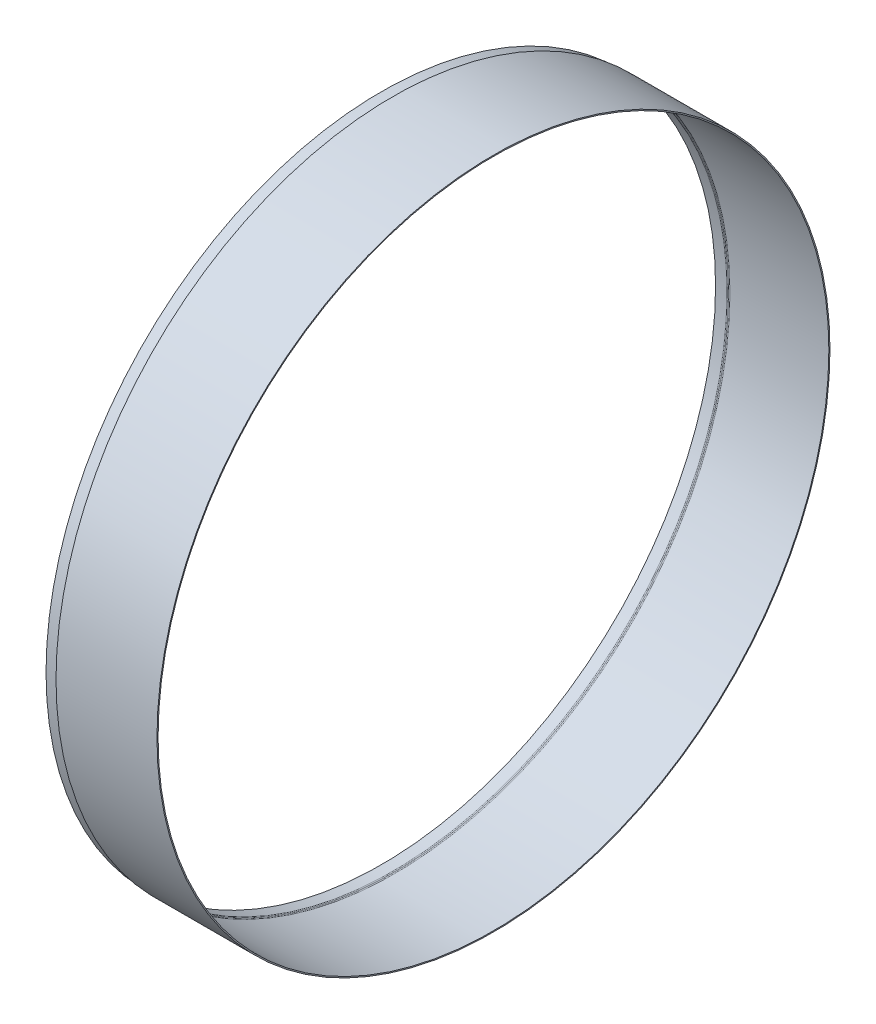
ISO-10303-21;
HEADER;
FILE_DESCRIPTION(('STEP AP214'),'2;1');
FILE_NAME('part.step','',(''),(''),'','','');
FILE_SCHEMA(('AUTOMOTIVE_DESIGN { 1 0 10303 214 1 1 1 1 }'));
ENDSEC;
DATA;
#1=APPLICATION_CONTEXT('core data for automotive mechanical design processes');
#2=APPLICATION_PROTOCOL_DEFINITION('international standard','automotive_design',2000,#1);
#3=PRODUCT_CONTEXT('',#1,'mechanical');
#4=PRODUCT('Part','Part','',(#3));
#5=PRODUCT_RELATED_PRODUCT_CATEGORY('part','',(#4));
#6=PRODUCT_DEFINITION_FORMATION('','',#4);
#7=PRODUCT_DEFINITION_CONTEXT('part definition',#1,'design');
#8=PRODUCT_DEFINITION('design','',#6,#7);
#9=PRODUCT_DEFINITION_SHAPE('','',#8);
#10=(LENGTH_UNIT() NAMED_UNIT(*) SI_UNIT(.MILLI.,.METRE.));
#11=(NAMED_UNIT(*) PLANE_ANGLE_UNIT() SI_UNIT($,.RADIAN.));
#12=(NAMED_UNIT(*) SI_UNIT($,.STERADIAN.) SOLID_ANGLE_UNIT());
#13=UNCERTAINTY_MEASURE_WITH_UNIT(LENGTH_MEASURE(1.E-05),#10,'distance_accuracy_value','');
#14=(GEOMETRIC_REPRESENTATION_CONTEXT(3) GLOBAL_UNCERTAINTY_ASSIGNED_CONTEXT((#13)) GLOBAL_UNIT_ASSIGNED_CONTEXT((#10,
#11,#12)) REPRESENTATION_CONTEXT('',''));
#15=CARTESIAN_POINT('',(0.,0.,0.));
#16=DIRECTION('',(0.,0.,1.));
#17=DIRECTION('',(1.,0.,0.));
#18=AXIS2_PLACEMENT_3D('',#15,#16,#17);
#19=CARTESIAN_POINT('',(-500.,0.,0.));
#20=DIRECTION('',(1.,0.,0.));
#21=DIRECTION('',(0.,0.,-1.));
#22=AXIS2_PLACEMENT_3D('',#19,#20,#21);
#23=CYLINDRICAL_SURFACE('',#22,1494.5);
#24=CARTESIAN_POINT('',(-450.,0.,0.));
#25=DIRECTION('',(1.,0.,0.));
#26=DIRECTION('',(0.,0.,-1.));
#27=AXIS2_PLACEMENT_3D('',#24,#25,#26);
#28=CIRCLE('',#27,1494.5);
#29=CARTESIAN_POINT('',(-450.,0.,-1494.5));
#30=VERTEX_POINT('',#29);
#31=EDGE_CURVE('E12',#30,#30,#28,.T.);
#32=ORIENTED_EDGE('',*,*,#31,.F.);
#33=EDGE_LOOP('',(#32));
#34=FACE_BOUND('',#33,.T.);
#35=CARTESIAN_POINT('',(-500.,0.,0.));
#36=DIRECTION('',(1.,0.,0.));
#37=DIRECTION('',(0.,0.,-1.));
#38=AXIS2_PLACEMENT_3D('',#35,#36,#37);
#39=CIRCLE('',#38,1494.5);
#40=CARTESIAN_POINT('',(-500.,0.,-1494.5));
#41=VERTEX_POINT('',#40);
#42=EDGE_CURVE('E76',#41,#41,#39,.T.);
#43=ORIENTED_EDGE('',*,*,#42,.T.);
#44=EDGE_LOOP('',(#43));
#45=FACE_BOUND('',#44,.T.);
#46=ADVANCED_FACE('F18',(#34,#45),#23,.T.);
#47=CARTESIAN_POINT('',(-450.,0.,0.));
#48=DIRECTION('',(-1.,0.,0.));
#49=DIRECTION('',(0.,0.,1.));
#50=AXIS2_PLACEMENT_3D('',#47,#48,#49);
#51=PLANE('',#50);
#52=ORIENTED_EDGE('',*,*,#31,.T.);
#53=EDGE_LOOP('',(#52));
#54=FACE_BOUND('',#53,.T.);
#55=CARTESIAN_POINT('',(-450.,0.,0.));
#56=DIRECTION('',(1.,0.,0.));
#57=DIRECTION('',(0.,0.,-1.));
#58=AXIS2_PLACEMENT_3D('',#55,#56,#57);
#59=CIRCLE('',#58,1500.);
#60=CARTESIAN_POINT('',(-450.,0.,-1500.));
#61=VERTEX_POINT('',#60);
#62=EDGE_CURVE('E29',#61,#61,#59,.T.);
#63=ORIENTED_EDGE('',*,*,#62,.F.);
#64=EDGE_LOOP('',(#63));
#65=FACE_BOUND('',#64,.T.);
#66=ADVANCED_FACE('F100',(#54,#65),#51,.T.);
#67=CARTESIAN_POINT('',(-450.,0.,0.));
#68=DIRECTION('',(1.,0.,0.));
#69=DIRECTION('',(0.,0.,-1.));
#70=AXIS2_PLACEMENT_3D('',#67,#68,#69);
#71=CYLINDRICAL_SURFACE('',#70,1500.);
#72=CARTESIAN_POINT('',(1.83084696472529E-13,0.,0.));
#73=DIRECTION('',(1.,0.,0.));
#74=DIRECTION('',(0.,0.,-1.));
#75=AXIS2_PLACEMENT_3D('',#72,#73,#74);
#76=CIRCLE('',#75,1500.);
#77=CARTESIAN_POINT('',(1.83697019872103E-13,0.,-1500.));
#78=VERTEX_POINT('',#77);
#79=EDGE_CURVE('E85',#78,#78,#76,.T.);
#80=ORIENTED_EDGE('',*,*,#79,.F.);
#81=EDGE_LOOP('',(#80));
#82=FACE_BOUND('',#81,.T.);
#83=ORIENTED_EDGE('',*,*,#62,.T.);
#84=EDGE_LOOP('',(#83));
#85=FACE_BOUND('',#84,.T.);
#86=ADVANCED_FACE('F98',(#82,#85),#71,.T.);
#87=CARTESIAN_POINT('',(1.83084696472529E-13,0.,0.));
#88=DIRECTION('',(1.,0.,0.));
#89=DIRECTION('',(0.,1.,0.));
#90=AXIS2_PLACEMENT_3D('',#87,#88,#89);
#91=PLANE('',#90);
#92=CARTESIAN_POINT('',(1.83084696472529E-13,0.,0.));
#93=DIRECTION('',(1.,0.,0.));
#94=DIRECTION('',(0.,0.,-1.));
#95=AXIS2_PLACEMENT_3D('',#92,#93,#94);
#96=CIRCLE('',#95,1495.);
#97=CARTESIAN_POINT('',(1.83084696472529E-13,0.,-1495.));
#98=VERTEX_POINT('',#97);
#99=EDGE_CURVE('E71',#98,#98,#96,.T.);
#100=ORIENTED_EDGE('',*,*,#99,.F.);
#101=EDGE_LOOP('',(#100));
#102=FACE_BOUND('',#101,.T.);
#103=ORIENTED_EDGE('',*,*,#79,.T.);
#104=EDGE_LOOP('',(#103));
#105=FACE_BOUND('',#104,.T.);
#106=ADVANCED_FACE('F108',(#102,#105),#91,.T.);
#107=CARTESIAN_POINT('',(1.83084696472529E-13,0.,0.));
#108=DIRECTION('',(1.,0.,0.));
#109=DIRECTION('',(0.,0.,-1.));
#110=AXIS2_PLACEMENT_3D('',#107,#108,#109);
#111=CYLINDRICAL_SURFACE('',#110,1495.);
#112=ORIENTED_EDGE('',*,*,#99,.T.);
#113=EDGE_LOOP('',(#112));
#114=FACE_BOUND('',#113,.T.);
#115=CARTESIAN_POINT('',(-440.669872981078,0.,0.));
#116=DIRECTION('',(1.,0.,0.));
#117=DIRECTION('',(0.,0.,-1.));
#118=AXIS2_PLACEMENT_3D('',#115,#116,#117);
#119=CIRCLE('',#118,1495.);
#120=CARTESIAN_POINT('',(-440.669872981078,0.,-1495.));
#121=VERTEX_POINT('',#120);
#122=EDGE_CURVE('E22',#121,#121,#119,.T.);
#123=ORIENTED_EDGE('',*,*,#122,.F.);
#124=EDGE_LOOP('',(#123));
#125=FACE_BOUND('',#124,.T.);
#126=ADVANCED_FACE('F115',(#114,#125),#111,.F.);
#127=CARTESIAN_POINT('',(-440.669872981078,0.,0.));
#128=DIRECTION('',(1.,0.,0.));
#129=DIRECTION('',(0.,0.,-1.));
#130=AXIS2_PLACEMENT_3D('',#127,#128,#129);
#131=TOROIDAL_SURFACE('',#130,1490.,5.);
#132=ORIENTED_EDGE('',*,*,#122,.T.);
#133=EDGE_LOOP('',(#132));
#134=FACE_BOUND('',#133,.T.);
#135=CARTESIAN_POINT('',(-445.,0.,0.));
#136=DIRECTION('',(1.,0.,0.));
#137=DIRECTION('',(0.,0.,-1.));
#138=AXIS2_PLACEMENT_3D('',#135,#136,#137);
#139=CIRCLE('',#138,1492.5);
#140=CARTESIAN_POINT('',(-445.,0.,-1492.5));
#141=VERTEX_POINT('',#140);
#142=EDGE_CURVE('E59',#141,#141,#139,.T.);
#143=ORIENTED_EDGE('',*,*,#142,.F.);
#144=EDGE_LOOP('',(#143));
#145=FACE_BOUND('',#144,.T.);
#146=ADVANCED_FACE('F123',(#134,#145),#131,.F.);
#147=CARTESIAN_POINT('',(-449.330127018922,0.,0.));
#148=DIRECTION('',(1.,0.,0.));
#149=DIRECTION('',(0.,0.,-1.));
#150=AXIS2_PLACEMENT_3D('',#147,#148,#149);
#151=TOROIDAL_SURFACE('',#150,1495.,5.);
#152=ORIENTED_EDGE('',*,*,#142,.T.);
#153=EDGE_LOOP('',(#152));
#154=FACE_BOUND('',#153,.T.);
#155=CARTESIAN_POINT('',(-449.330127018922,0.,0.));
#156=DIRECTION('',(1.,0.,0.));
#157=DIRECTION('',(0.,0.,-1.));
#158=AXIS2_PLACEMENT_3D('',#155,#156,#157);
#159=CIRCLE('',#158,1490.);
#160=CARTESIAN_POINT('',(-449.330127018922,0.,-1490.));
#161=VERTEX_POINT('',#160);
#162=EDGE_CURVE('E64',#161,#161,#159,.T.);
#163=ORIENTED_EDGE('',*,*,#162,.F.);
#164=EDGE_LOOP('',(#163));
#165=FACE_BOUND('',#164,.T.);
#166=ADVANCED_FACE('F60',(#154,#165),#151,.T.);
#167=CARTESIAN_POINT('',(-449.330127018922,0.,0.));
#168=DIRECTION('',(1.,0.,0.));
#169=DIRECTION('',(0.,0.,-1.));
#170=AXIS2_PLACEMENT_3D('',#167,#168,#169);
#171=CYLINDRICAL_SURFACE('',#170,1490.);
#172=ORIENTED_EDGE('',*,*,#162,.T.);
#173=EDGE_LOOP('',(#172));
#174=FACE_BOUND('',#173,.T.);
#175=CARTESIAN_POINT('',(-500.,0.,0.));
#176=DIRECTION('',(1.,0.,0.));
#177=DIRECTION('',(0.,0.,-1.));
#178=AXIS2_PLACEMENT_3D('',#175,#176,#177);
#179=CIRCLE('',#178,1490.);
#180=CARTESIAN_POINT('',(-500.,0.,-1490.));
#181=VERTEX_POINT('',#180);
#182=EDGE_CURVE('E72',#181,#181,#179,.T.);
#183=ORIENTED_EDGE('',*,*,#182,.F.);
#184=EDGE_LOOP('',(#183));
#185=FACE_BOUND('',#184,.T.);
#186=ADVANCED_FACE('F116',(#174,#185),#171,.F.);
#187=CARTESIAN_POINT('',(-500.,0.,0.));
#188=DIRECTION('',(-1.,0.,0.));
#189=DIRECTION('',(0.,0.,1.));
#190=AXIS2_PLACEMENT_3D('',#187,#188,#189);
#191=PLANE('',#190);
#192=ORIENTED_EDGE('',*,*,#182,.T.);
#193=EDGE_LOOP('',(#192));
#194=FACE_BOUND('',#193,.T.);
#195=ORIENTED_EDGE('',*,*,#42,.F.);
#196=EDGE_LOOP('',(#195));
#197=FACE_BOUND('',#196,.T.);
#198=ADVANCED_FACE('F20',(#194,#197),#191,.T.);
#199=CLOSED_SHELL('',(#46,#66,#86,#106,#126,#146,#166,#186,#198));
#200=MANIFOLD_SOLID_BREP('B1',#199);
#201=ADVANCED_BREP_SHAPE_REPRESENTATION('',(#18,#200),#14);
#202=SHAPE_DEFINITION_REPRESENTATION(#9,#201);
ENDSEC;
END-ISO-10303-21;
